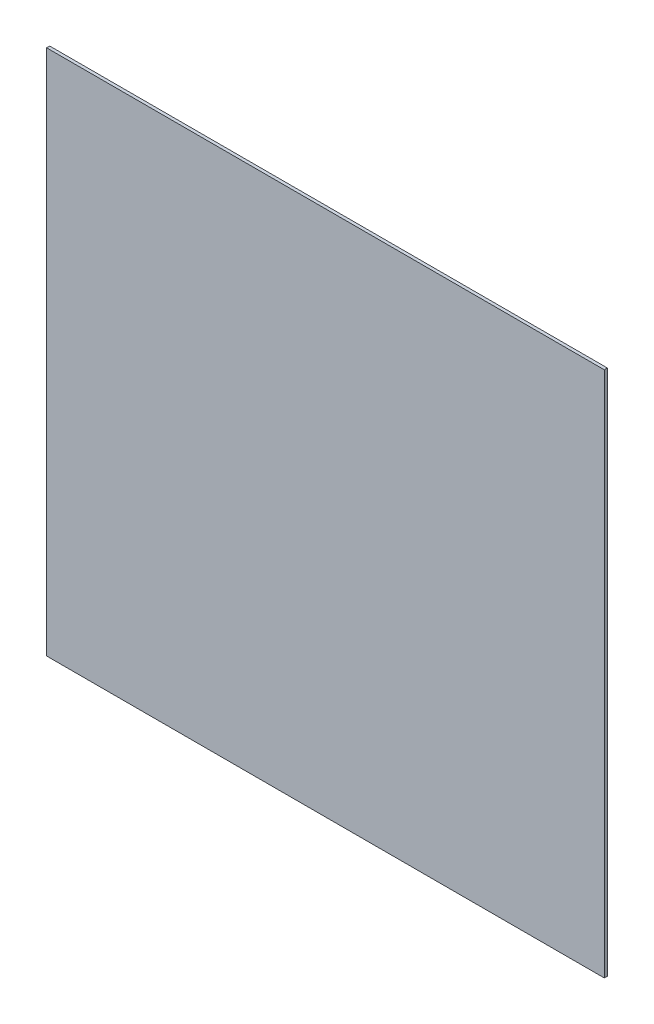
ISO-10303-21;
HEADER;
FILE_DESCRIPTION(('STEP AP214'),'2;1');
FILE_NAME('part.step','',(''),(''),'','','');
FILE_SCHEMA(('AUTOMOTIVE_DESIGN { 1 0 10303 214 1 1 1 1 }'));
ENDSEC;
DATA;
#1=APPLICATION_CONTEXT('core data for automotive mechanical design processes');
#2=APPLICATION_PROTOCOL_DEFINITION('international standard','automotive_design',2000,#1);
#3=PRODUCT_CONTEXT('',#1,'mechanical');
#4=PRODUCT('Part','Part','',(#3));
#5=PRODUCT_RELATED_PRODUCT_CATEGORY('part','',(#4));
#6=PRODUCT_DEFINITION_FORMATION('','',#4);
#7=PRODUCT_DEFINITION_CONTEXT('part definition',#1,'design');
#8=PRODUCT_DEFINITION('design','',#6,#7);
#9=PRODUCT_DEFINITION_SHAPE('','',#8);
#10=(LENGTH_UNIT() NAMED_UNIT(*) SI_UNIT(.MILLI.,.METRE.));
#11=(NAMED_UNIT(*) PLANE_ANGLE_UNIT() SI_UNIT($,.RADIAN.));
#12=(NAMED_UNIT(*) SI_UNIT($,.STERADIAN.) SOLID_ANGLE_UNIT());
#13=UNCERTAINTY_MEASURE_WITH_UNIT(LENGTH_MEASURE(1.E-05),#10,'distance_accuracy_value','');
#14=(GEOMETRIC_REPRESENTATION_CONTEXT(3) GLOBAL_UNCERTAINTY_ASSIGNED_CONTEXT((#13)) GLOBAL_UNIT_ASSIGNED_CONTEXT((#10,
#11,#12)) REPRESENTATION_CONTEXT('',''));
#15=CARTESIAN_POINT('',(0.,0.,0.));
#16=DIRECTION('',(0.,0.,1.));
#17=DIRECTION('',(1.,0.,0.));
#18=AXIS2_PLACEMENT_3D('',#15,#16,#17);
#19=CARTESIAN_POINT('',(-270.,255.,3.));
#20=DIRECTION('',(1.,0.,0.));
#21=DIRECTION('',(0.,1.,0.));
#22=AXIS2_PLACEMENT_3D('',#19,#20,#21);
#23=PLANE('',#22);
#24=DIRECTION('',(0.,-1.,0.));
#25=VECTOR('',#24,1.);
#26=CARTESIAN_POINT('',(-270.,255.,0.));
#27=LINE('',#26,#25);
#28=CARTESIAN_POINT('',(-270.,255.,0.));
#29=VERTEX_POINT('',#28);
#30=CARTESIAN_POINT('',(-270.,-255.,0.));
#31=VERTEX_POINT('',#30);
#32=EDGE_CURVE('E105',#29,#31,#27,.T.);
#33=ORIENTED_EDGE('',*,*,#32,.T.);
#34=DIRECTION('',(0.,0.,-1.));
#35=VECTOR('',#34,1.);
#36=CARTESIAN_POINT('',(-270.,-255.,3.));
#37=LINE('',#36,#35);
#38=CARTESIAN_POINT('',(-270.,-255.,3.));
#39=VERTEX_POINT('',#38);
#40=EDGE_CURVE('E11',#39,#31,#37,.T.);
#41=ORIENTED_EDGE('',*,*,#40,.F.);
#42=DIRECTION('',(0.,-1.,0.));
#43=VECTOR('',#42,1.);
#44=CARTESIAN_POINT('',(-270.,255.,3.));
#45=LINE('',#44,#43);
#46=CARTESIAN_POINT('',(-270.,255.,3.));
#47=VERTEX_POINT('',#46);
#48=EDGE_CURVE('E89',#47,#39,#45,.T.);
#49=ORIENTED_EDGE('',*,*,#48,.F.);
#50=DIRECTION('',(0.,0.,-1.));
#51=VECTOR('',#50,1.);
#52=CARTESIAN_POINT('',(-270.,255.,3.));
#53=LINE('',#52,#51);
#54=EDGE_CURVE('E101',#47,#29,#53,.T.);
#55=ORIENTED_EDGE('',*,*,#54,.T.);
#56=EDGE_LOOP('',(#33,#41,#49,#55));
#57=FACE_BOUND('',#56,.T.);
#58=ADVANCED_FACE('F37',(#57),#23,.F.);
#59=CARTESIAN_POINT('',(270.,-255.,3.));
#60=DIRECTION('',(0.,1.,0.));
#61=DIRECTION('',(-1.,0.,0.));
#62=AXIS2_PLACEMENT_3D('',#59,#60,#61);
#63=PLANE('',#62);
#64=DIRECTION('',(1.,0.,0.));
#65=VECTOR('',#64,1.);
#66=CARTESIAN_POINT('',(270.,-255.,0.));
#67=LINE('',#66,#65);
#68=CARTESIAN_POINT('',(270.,-255.,0.));
#69=VERTEX_POINT('',#68);
#70=EDGE_CURVE('E94',#31,#69,#67,.T.);
#71=ORIENTED_EDGE('',*,*,#70,.T.);
#72=DIRECTION('',(0.,0.,-1.));
#73=VECTOR('',#72,1.);
#74=CARTESIAN_POINT('',(270.,-255.,3.));
#75=LINE('',#74,#73);
#76=CARTESIAN_POINT('',(270.,-255.,3.));
#77=VERTEX_POINT('',#76);
#78=EDGE_CURVE('E46',#77,#69,#75,.T.);
#79=ORIENTED_EDGE('',*,*,#78,.F.);
#80=DIRECTION('',(1.,0.,0.));
#81=VECTOR('',#80,1.);
#82=CARTESIAN_POINT('',(270.,-255.,3.));
#83=LINE('',#82,#81);
#84=EDGE_CURVE('E84',#39,#77,#83,.T.);
#85=ORIENTED_EDGE('',*,*,#84,.F.);
#86=ORIENTED_EDGE('',*,*,#40,.T.);
#87=EDGE_LOOP('',(#71,#79,#85,#86));
#88=FACE_BOUND('',#87,.T.);
#89=ADVANCED_FACE('F93',(#88),#63,.F.);
#90=CARTESIAN_POINT('',(270.,255.,3.));
#91=DIRECTION('',(-1.,0.,0.));
#92=DIRECTION('',(0.,-1.,0.));
#93=AXIS2_PLACEMENT_3D('',#90,#91,#92);
#94=PLANE('',#93);
#95=DIRECTION('',(0.,1.,0.));
#96=VECTOR('',#95,1.);
#97=CARTESIAN_POINT('',(270.,255.,0.));
#98=LINE('',#97,#96);
#99=CARTESIAN_POINT('',(270.,255.,0.));
#100=VERTEX_POINT('',#99);
#101=EDGE_CURVE('E71',#69,#100,#98,.T.);
#102=ORIENTED_EDGE('',*,*,#101,.T.);
#103=DIRECTION('',(0.,0.,-1.));
#104=VECTOR('',#103,1.);
#105=CARTESIAN_POINT('',(270.,255.,3.));
#106=LINE('',#105,#104);
#107=CARTESIAN_POINT('',(270.,255.,3.));
#108=VERTEX_POINT('',#107);
#109=EDGE_CURVE('E96',#108,#100,#106,.T.);
#110=ORIENTED_EDGE('',*,*,#109,.F.);
#111=DIRECTION('',(0.,1.,0.));
#112=VECTOR('',#111,1.);
#113=CARTESIAN_POINT('',(270.,255.,3.));
#114=LINE('',#113,#112);
#115=EDGE_CURVE('E87',#77,#108,#114,.T.);
#116=ORIENTED_EDGE('',*,*,#115,.F.);
#117=ORIENTED_EDGE('',*,*,#78,.T.);
#118=EDGE_LOOP('',(#102,#110,#116,#117));
#119=FACE_BOUND('',#118,.T.);
#120=ADVANCED_FACE('F97',(#119),#94,.F.);
#121=CARTESIAN_POINT('',(270.,255.,3.));
#122=DIRECTION('',(0.,-1.,0.));
#123=DIRECTION('',(1.,0.,0.));
#124=AXIS2_PLACEMENT_3D('',#121,#122,#123);
#125=PLANE('',#124);
#126=DIRECTION('',(-1.,0.,0.));
#127=VECTOR('',#126,1.);
#128=CARTESIAN_POINT('',(270.,255.,0.));
#129=LINE('',#128,#127);
#130=EDGE_CURVE('E77',#100,#29,#129,.T.);
#131=ORIENTED_EDGE('',*,*,#130,.T.);
#132=ORIENTED_EDGE('',*,*,#54,.F.);
#133=DIRECTION('',(-1.,0.,0.));
#134=VECTOR('',#133,1.);
#135=CARTESIAN_POINT('',(270.,255.,3.));
#136=LINE('',#135,#134);
#137=EDGE_CURVE('E54',#108,#47,#136,.T.);
#138=ORIENTED_EDGE('',*,*,#137,.F.);
#139=ORIENTED_EDGE('',*,*,#109,.T.);
#140=EDGE_LOOP('',(#131,#132,#138,#139));
#141=FACE_BOUND('',#140,.T.);
#142=ADVANCED_FACE('F118',(#141),#125,.F.);
#143=CARTESIAN_POINT('',(0.,0.,3.));
#144=DIRECTION('',(0.,0.,-1.));
#145=DIRECTION('',(-1.,0.,0.));
#146=AXIS2_PLACEMENT_3D('',#143,#144,#145);
#147=PLANE('',#146);
#148=ORIENTED_EDGE('',*,*,#48,.T.);
#149=ORIENTED_EDGE('',*,*,#84,.T.);
#150=ORIENTED_EDGE('',*,*,#115,.T.);
#151=ORIENTED_EDGE('',*,*,#137,.T.);
#152=EDGE_LOOP('',(#148,#149,#150,#151));
#153=FACE_BOUND('',#152,.T.);
#154=ADVANCED_FACE('F85',(#153),#147,.F.);
#155=CARTESIAN_POINT('',(0.,0.,0.));
#156=DIRECTION('',(0.,0.,-1.));
#157=DIRECTION('',(-1.,0.,0.));
#158=AXIS2_PLACEMENT_3D('',#155,#156,#157);
#159=PLANE('',#158);
#160=ORIENTED_EDGE('',*,*,#32,.F.);
#161=ORIENTED_EDGE('',*,*,#130,.F.);
#162=ORIENTED_EDGE('',*,*,#101,.F.);
#163=ORIENTED_EDGE('',*,*,#70,.F.);
#164=EDGE_LOOP('',(#160,#161,#162,#163));
#165=FACE_BOUND('',#164,.T.);
#166=ADVANCED_FACE('F121',(#165),#159,.T.);
#167=CLOSED_SHELL('',(#58,#89,#120,#142,#154,#166));
#168=MANIFOLD_SOLID_BREP('B2',#167);
#169=ADVANCED_BREP_SHAPE_REPRESENTATION('',(#18,#168),#14);
#170=SHAPE_DEFINITION_REPRESENTATION(#9,#169);
ENDSEC;
END-ISO-10303-21;
